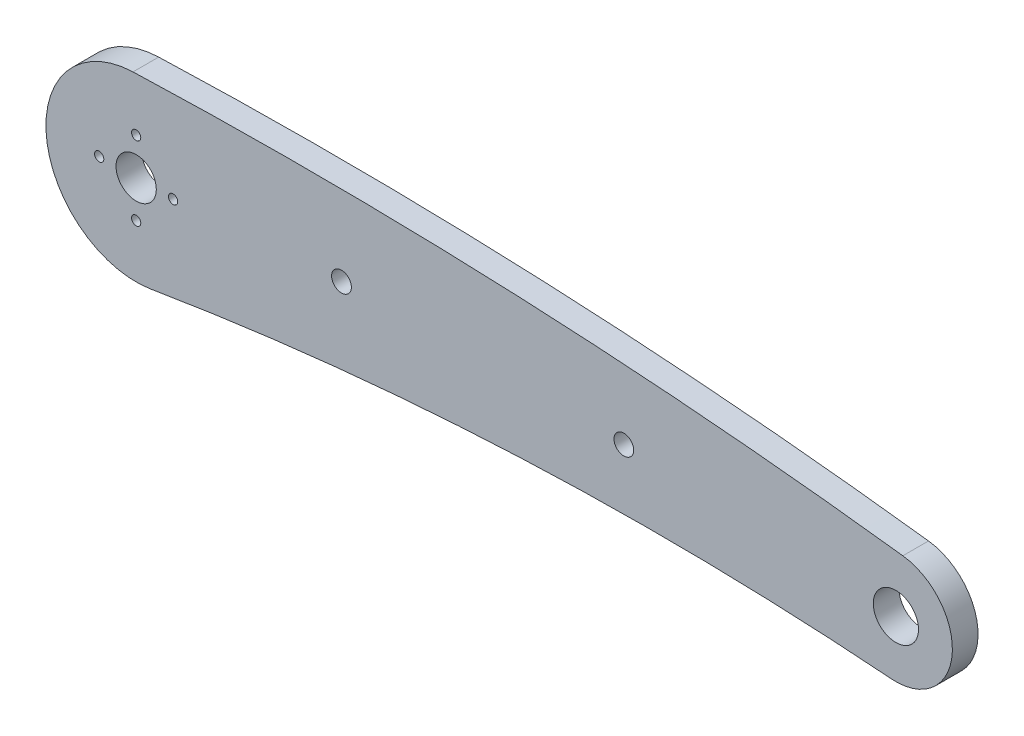
ISO-10303-21;
HEADER;
FILE_DESCRIPTION(('STEP AP214'),'2;1');
FILE_NAME('part.step','',(''),(''),'','','');
FILE_SCHEMA(('AUTOMOTIVE_DESIGN { 1 0 10303 214 1 1 1 1 }'));
ENDSEC;
DATA;
#1=APPLICATION_CONTEXT('core data for automotive mechanical design processes');
#2=APPLICATION_PROTOCOL_DEFINITION('international standard','automotive_design',2000,#1);
#3=PRODUCT_CONTEXT('',#1,'mechanical');
#4=PRODUCT('Part','Part','',(#3));
#5=PRODUCT_RELATED_PRODUCT_CATEGORY('part','',(#4));
#6=PRODUCT_DEFINITION_FORMATION('','',#4);
#7=PRODUCT_DEFINITION_CONTEXT('part definition',#1,'design');
#8=PRODUCT_DEFINITION('design','',#6,#7);
#9=PRODUCT_DEFINITION_SHAPE('','',#8);
#10=(LENGTH_UNIT() NAMED_UNIT(*) SI_UNIT(.MILLI.,.METRE.));
#11=(NAMED_UNIT(*) PLANE_ANGLE_UNIT() SI_UNIT($,.RADIAN.));
#12=(NAMED_UNIT(*) SI_UNIT($,.STERADIAN.) SOLID_ANGLE_UNIT());
#13=UNCERTAINTY_MEASURE_WITH_UNIT(LENGTH_MEASURE(1.E-05),#10,'distance_accuracy_value','');
#14=(GEOMETRIC_REPRESENTATION_CONTEXT(3) GLOBAL_UNCERTAINTY_ASSIGNED_CONTEXT((#13)) GLOBAL_UNIT_ASSIGNED_CONTEXT((#10,
#11,#12)) REPRESENTATION_CONTEXT('',''));
#15=CARTESIAN_POINT('',(0.,0.,0.));
#16=DIRECTION('',(0.,0.,1.));
#17=DIRECTION('',(1.,0.,0.));
#18=AXIS2_PLACEMENT_3D('',#15,#16,#17);
#19=CARTESIAN_POINT('',(16.2151699746623,-465.930427659477,0.));
#20=DIRECTION('',(0.,0.,1.));
#21=DIRECTION('',(1.,0.,0.));
#22=AXIS2_PLACEMENT_3D('',#19,#20,#21);
#23=PLANE('',#22);
#24=CARTESIAN_POINT('',(148.,0.,0.));
#25=DIRECTION('',(0.,0.,-1.));
#26=DIRECTION('',(-1.,0.,0.));
#27=AXIS2_PLACEMENT_3D('',#24,#25,#26);
#28=CIRCLE('',#27,10.9999999999999);
#29=CARTESIAN_POINT('',(147.159069573998,-10.9678090801501,0.));
#30=VERTEX_POINT('',#29);
#31=CARTESIAN_POINT('',(149.353851182702,10.9163678471869,0.));
#32=VERTEX_POINT('',#31);
#33=EDGE_CURVE('E61',#30,#32,#28,.F.);
#34=ORIENTED_EDGE('',*,*,#33,.F.);
#35=CARTESIAN_POINT('',(101.290137246622,-609.211940724704,0.));
#36=DIRECTION('',(0.,0.,-1.));
#37=DIRECTION('',(-1.,0.,0.));
#38=AXIS2_PLACEMENT_3D('',#35,#36,#37);
#39=CIRCLE('',#38,600.);
#40=CARTESIAN_POINT('',(2.88252303300712,-17.3370033732529,0.));
#41=VERTEX_POINT('',#40);
#42=EDGE_CURVE('E76',#30,#41,#39,.F.);
#43=ORIENTED_EDGE('',*,*,#42,.T.);
#44=CARTESIAN_POINT('',(0.,0.,0.));
#45=DIRECTION('',(0.,0.,-1.));
#46=DIRECTION('',(-1.,0.,0.));
#47=AXIS2_PLACEMENT_3D('',#44,#45,#46);
#48=CIRCLE('',#47,17.5749999999999);
#49=CARTESIAN_POINT('',(-0.611269779992363,17.5643666056043,0.));
#50=VERTEX_POINT('',#49);
#51=EDGE_CURVE('E62',#50,#41,#48,.F.);
#52=ORIENTED_EDGE('',*,*,#51,.F.);
#53=CARTESIAN_POINT('',(32.4303399493245,-931.860855318953,0.));
#54=DIRECTION('',(0.,0.,-1.));
#55=DIRECTION('',(-1.,0.,0.));
#56=AXIS2_PLACEMENT_3D('',#53,#54,#55);
#57=CIRCLE('',#56,950.);
#58=EDGE_CURVE('E56',#32,#50,#57,.F.);
#59=ORIENTED_EDGE('',*,*,#58,.F.);
#60=EDGE_LOOP('',(#34,#43,#52,#59));
#61=FACE_BOUND('',#60,.T.);
#62=CARTESIAN_POINT('',(0.,0.,0.));
#63=DIRECTION('',(0.,0.,1.));
#64=DIRECTION('',(1.,0.,0.));
#65=AXIS2_PLACEMENT_3D('',#62,#63,#64);
#66=CIRCLE('',#65,3.925);
#67=CARTESIAN_POINT('',(3.925,0.,0.));
#68=VERTEX_POINT('',#67);
#69=EDGE_CURVE('E66',#68,#68,#66,.T.);
#70=ORIENTED_EDGE('',*,*,#69,.T.);
#71=EDGE_LOOP('',(#70));
#72=FACE_BOUND('',#71,.T.);
#73=CARTESIAN_POINT('',(148.,0.,0.));
#74=DIRECTION('',(0.,0.,1.));
#75=DIRECTION('',(1.,0.,0.));
#76=AXIS2_PLACEMENT_3D('',#73,#74,#75);
#77=CIRCLE('',#76,4.39999999999999);
#78=CARTESIAN_POINT('',(152.4,0.,0.));
#79=VERTEX_POINT('',#78);
#80=EDGE_CURVE('E87',#79,#79,#77,.T.);
#81=ORIENTED_EDGE('',*,*,#80,.T.);
#82=EDGE_LOOP('',(#81));
#83=FACE_BOUND('',#82,.T.);
#84=CARTESIAN_POINT('',(0.,7.2,0.));
#85=DIRECTION('',(0.,0.,1.));
#86=DIRECTION('',(1.,0.,0.));
#87=AXIS2_PLACEMENT_3D('',#84,#85,#86);
#88=CIRCLE('',#87,0.9);
#89=CARTESIAN_POINT('',(0.9,7.2,0.));
#90=VERTEX_POINT('',#89);
#91=EDGE_CURVE('E90',#90,#90,#88,.T.);
#92=ORIENTED_EDGE('',*,*,#91,.T.);
#93=EDGE_LOOP('',(#92));
#94=FACE_BOUND('',#93,.T.);
#95=CARTESIAN_POINT('',(0.,-7.2,0.));
#96=DIRECTION('',(0.,0.,1.));
#97=DIRECTION('',(1.,0.,0.));
#98=AXIS2_PLACEMENT_3D('',#95,#96,#97);
#99=CIRCLE('',#98,0.9);
#100=CARTESIAN_POINT('',(0.9,-7.2,0.));
#101=VERTEX_POINT('',#100);
#102=EDGE_CURVE('E93',#101,#101,#99,.T.);
#103=ORIENTED_EDGE('',*,*,#102,.T.);
#104=EDGE_LOOP('',(#103));
#105=FACE_BOUND('',#104,.T.);
#106=CARTESIAN_POINT('',(7.2,0.,0.));
#107=DIRECTION('',(0.,0.,1.));
#108=DIRECTION('',(1.,0.,0.));
#109=AXIS2_PLACEMENT_3D('',#106,#107,#108);
#110=CIRCLE('',#109,0.9);
#111=CARTESIAN_POINT('',(8.1,0.,0.));
#112=VERTEX_POINT('',#111);
#113=EDGE_CURVE('E96',#112,#112,#110,.T.);
#114=ORIENTED_EDGE('',*,*,#113,.T.);
#115=EDGE_LOOP('',(#114));
#116=FACE_BOUND('',#115,.T.);
#117=CARTESIAN_POINT('',(-7.2,0.,0.));
#118=DIRECTION('',(0.,0.,1.));
#119=DIRECTION('',(1.,0.,0.));
#120=AXIS2_PLACEMENT_3D('',#117,#118,#119);
#121=CIRCLE('',#120,0.9);
#122=CARTESIAN_POINT('',(-6.3,0.,0.));
#123=VERTEX_POINT('',#122);
#124=EDGE_CURVE('E99',#123,#123,#121,.T.);
#125=ORIENTED_EDGE('',*,*,#124,.T.);
#126=EDGE_LOOP('',(#125));
#127=FACE_BOUND('',#126,.T.);
#128=CARTESIAN_POINT('',(40.,2.5,0.));
#129=DIRECTION('',(0.,0.,1.));
#130=DIRECTION('',(1.,0.,0.));
#131=AXIS2_PLACEMENT_3D('',#128,#129,#130);
#132=CIRCLE('',#131,1.925);
#133=CARTESIAN_POINT('',(41.925,2.5,0.));
#134=VERTEX_POINT('',#133);
#135=EDGE_CURVE('E101',#134,#134,#132,.T.);
#136=ORIENTED_EDGE('',*,*,#135,.T.);
#137=EDGE_LOOP('',(#136));
#138=FACE_BOUND('',#137,.T.);
#139=CARTESIAN_POINT('',(95.,2.5,0.));
#140=DIRECTION('',(0.,0.,1.));
#141=DIRECTION('',(1.,0.,0.));
#142=AXIS2_PLACEMENT_3D('',#139,#140,#141);
#143=CIRCLE('',#142,1.925);
#144=CARTESIAN_POINT('',(96.925,2.5,0.));
#145=VERTEX_POINT('',#144);
#146=EDGE_CURVE('E20',#145,#145,#143,.T.);
#147=ORIENTED_EDGE('',*,*,#146,.T.);
#148=EDGE_LOOP('',(#147));
#149=FACE_BOUND('',#148,.T.);
#150=ADVANCED_FACE('F17',(#61,#72,#83,#94,#105,#116,#127,#138,#149),#23,.F.);
#151=CARTESIAN_POINT('',(95.,2.5,-2.));
#152=DIRECTION('',(0.,0.,1.));
#153=DIRECTION('',(1.,0.,0.));
#154=AXIS2_PLACEMENT_3D('',#151,#152,#153);
#155=CYLINDRICAL_SURFACE('',#154,1.925);
#156=CARTESIAN_POINT('',(95.,2.5,5.));
#157=DIRECTION('',(0.,0.,1.));
#158=DIRECTION('',(1.,0.,0.));
#159=AXIS2_PLACEMENT_3D('',#156,#157,#158);
#160=CIRCLE('',#159,1.925);
#161=CARTESIAN_POINT('',(96.925,2.5,5.));
#162=VERTEX_POINT('',#161);
#163=EDGE_CURVE('E81',#162,#162,#160,.F.);
#164=ORIENTED_EDGE('',*,*,#163,.F.);
#165=EDGE_LOOP('',(#164));
#166=FACE_BOUND('',#165,.T.);
#167=ORIENTED_EDGE('',*,*,#146,.F.);
#168=EDGE_LOOP('',(#167));
#169=FACE_BOUND('',#168,.T.);
#170=ADVANCED_FACE('F109',(#166,#169),#155,.F.);
#171=CARTESIAN_POINT('',(40.,2.5,-2.));
#172=DIRECTION('',(0.,0.,1.));
#173=DIRECTION('',(1.,0.,0.));
#174=AXIS2_PLACEMENT_3D('',#171,#172,#173);
#175=CYLINDRICAL_SURFACE('',#174,1.925);
#176=CARTESIAN_POINT('',(40.,2.5,5.));
#177=DIRECTION('',(0.,0.,1.));
#178=DIRECTION('',(1.,0.,0.));
#179=AXIS2_PLACEMENT_3D('',#176,#177,#178);
#180=CIRCLE('',#179,1.925);
#181=CARTESIAN_POINT('',(41.925,2.5,5.));
#182=VERTEX_POINT('',#181);
#183=EDGE_CURVE('E174',#182,#182,#180,.F.);
#184=ORIENTED_EDGE('',*,*,#183,.F.);
#185=EDGE_LOOP('',(#184));
#186=FACE_BOUND('',#185,.T.);
#187=ORIENTED_EDGE('',*,*,#135,.F.);
#188=EDGE_LOOP('',(#187));
#189=FACE_BOUND('',#188,.T.);
#190=ADVANCED_FACE('F111',(#186,#189),#175,.F.);
#191=CARTESIAN_POINT('',(-7.2,0.,-2.));
#192=DIRECTION('',(0.,0.,1.));
#193=DIRECTION('',(1.,0.,0.));
#194=AXIS2_PLACEMENT_3D('',#191,#192,#193);
#195=CYLINDRICAL_SURFACE('',#194,0.9);
#196=CARTESIAN_POINT('',(-7.2,0.,5.));
#197=DIRECTION('',(0.,0.,1.));
#198=DIRECTION('',(1.,0.,0.));
#199=AXIS2_PLACEMENT_3D('',#196,#197,#198);
#200=CIRCLE('',#199,0.9);
#201=CARTESIAN_POINT('',(-6.3,0.,5.));
#202=VERTEX_POINT('',#201);
#203=EDGE_CURVE('E169',#202,#202,#200,.F.);
#204=ORIENTED_EDGE('',*,*,#203,.F.);
#205=EDGE_LOOP('',(#204));
#206=FACE_BOUND('',#205,.T.);
#207=ORIENTED_EDGE('',*,*,#124,.F.);
#208=EDGE_LOOP('',(#207));
#209=FACE_BOUND('',#208,.T.);
#210=ADVANCED_FACE('F118',(#206,#209),#195,.F.);
#211=CARTESIAN_POINT('',(7.2,0.,-2.));
#212=DIRECTION('',(0.,0.,1.));
#213=DIRECTION('',(1.,0.,0.));
#214=AXIS2_PLACEMENT_3D('',#211,#212,#213);
#215=CYLINDRICAL_SURFACE('',#214,0.9);
#216=CARTESIAN_POINT('',(7.2,0.,5.));
#217=DIRECTION('',(0.,0.,1.));
#218=DIRECTION('',(1.,0.,0.));
#219=AXIS2_PLACEMENT_3D('',#216,#217,#218);
#220=CIRCLE('',#219,0.9);
#221=CARTESIAN_POINT('',(8.1,0.,5.));
#222=VERTEX_POINT('',#221);
#223=EDGE_CURVE('E173',#222,#222,#220,.F.);
#224=ORIENTED_EDGE('',*,*,#223,.F.);
#225=EDGE_LOOP('',(#224));
#226=FACE_BOUND('',#225,.T.);
#227=ORIENTED_EDGE('',*,*,#113,.F.);
#228=EDGE_LOOP('',(#227));
#229=FACE_BOUND('',#228,.T.);
#230=ADVANCED_FACE('F157',(#226,#229),#215,.F.);
#231=CARTESIAN_POINT('',(0.,-7.2,-2.));
#232=DIRECTION('',(0.,0.,1.));
#233=DIRECTION('',(1.,0.,0.));
#234=AXIS2_PLACEMENT_3D('',#231,#232,#233);
#235=CYLINDRICAL_SURFACE('',#234,0.9);
#236=CARTESIAN_POINT('',(0.,-7.2,5.));
#237=DIRECTION('',(0.,0.,1.));
#238=DIRECTION('',(1.,0.,0.));
#239=AXIS2_PLACEMENT_3D('',#236,#237,#238);
#240=CIRCLE('',#239,0.9);
#241=CARTESIAN_POINT('',(0.9,-7.2,5.));
#242=VERTEX_POINT('',#241);
#243=EDGE_CURVE('E177',#242,#242,#240,.F.);
#244=ORIENTED_EDGE('',*,*,#243,.F.);
#245=EDGE_LOOP('',(#244));
#246=FACE_BOUND('',#245,.T.);
#247=ORIENTED_EDGE('',*,*,#102,.F.);
#248=EDGE_LOOP('',(#247));
#249=FACE_BOUND('',#248,.T.);
#250=ADVANCED_FACE('F153',(#246,#249),#235,.F.);
#251=CARTESIAN_POINT('',(0.,7.2,-2.));
#252=DIRECTION('',(0.,0.,1.));
#253=DIRECTION('',(1.,0.,0.));
#254=AXIS2_PLACEMENT_3D('',#251,#252,#253);
#255=CYLINDRICAL_SURFACE('',#254,0.9);
#256=CARTESIAN_POINT('',(0.,7.2,5.));
#257=DIRECTION('',(0.,0.,1.));
#258=DIRECTION('',(1.,0.,0.));
#259=AXIS2_PLACEMENT_3D('',#256,#257,#258);
#260=CIRCLE('',#259,0.9);
#261=CARTESIAN_POINT('',(0.9,7.2,5.));
#262=VERTEX_POINT('',#261);
#263=EDGE_CURVE('E183',#262,#262,#260,.F.);
#264=ORIENTED_EDGE('',*,*,#263,.F.);
#265=EDGE_LOOP('',(#264));
#266=FACE_BOUND('',#265,.T.);
#267=ORIENTED_EDGE('',*,*,#91,.F.);
#268=EDGE_LOOP('',(#267));
#269=FACE_BOUND('',#268,.T.);
#270=ADVANCED_FACE('F149',(#266,#269),#255,.F.);
#271=CARTESIAN_POINT('',(148.,0.,-2.));
#272=DIRECTION('',(0.,0.,1.));
#273=DIRECTION('',(1.,0.,0.));
#274=AXIS2_PLACEMENT_3D('',#271,#272,#273);
#275=CYLINDRICAL_SURFACE('',#274,4.39999999999999);
#276=CARTESIAN_POINT('',(148.,0.,5.));
#277=DIRECTION('',(0.,0.,1.));
#278=DIRECTION('',(1.,0.,0.));
#279=AXIS2_PLACEMENT_3D('',#276,#277,#278);
#280=CIRCLE('',#279,4.39999999999999);
#281=CARTESIAN_POINT('',(152.4,0.,5.));
#282=VERTEX_POINT('',#281);
#283=EDGE_CURVE('E186',#282,#282,#280,.F.);
#284=ORIENTED_EDGE('',*,*,#283,.F.);
#285=EDGE_LOOP('',(#284));
#286=FACE_BOUND('',#285,.T.);
#287=ORIENTED_EDGE('',*,*,#80,.F.);
#288=EDGE_LOOP('',(#287));
#289=FACE_BOUND('',#288,.T.);
#290=ADVANCED_FACE('F145',(#286,#289),#275,.F.);
#291=CARTESIAN_POINT('',(0.,0.,-2.));
#292=DIRECTION('',(0.,0.,1.));
#293=DIRECTION('',(1.,0.,0.));
#294=AXIS2_PLACEMENT_3D('',#291,#292,#293);
#295=CYLINDRICAL_SURFACE('',#294,3.925);
#296=CARTESIAN_POINT('',(0.,0.,5.));
#297=DIRECTION('',(0.,0.,1.));
#298=DIRECTION('',(1.,0.,0.));
#299=AXIS2_PLACEMENT_3D('',#296,#297,#298);
#300=CIRCLE('',#299,3.925);
#301=CARTESIAN_POINT('',(3.925,0.,5.));
#302=VERTEX_POINT('',#301);
#303=EDGE_CURVE('E189',#302,#302,#300,.F.);
#304=ORIENTED_EDGE('',*,*,#303,.F.);
#305=EDGE_LOOP('',(#304));
#306=FACE_BOUND('',#305,.T.);
#307=ORIENTED_EDGE('',*,*,#69,.F.);
#308=EDGE_LOOP('',(#307));
#309=FACE_BOUND('',#308,.T.);
#310=ADVANCED_FACE('F142',(#306,#309),#295,.F.);
#311=CARTESIAN_POINT('',(32.4303399493245,-931.860855318953,5.));
#312=DIRECTION('',(0.,0.,-1.));
#313=DIRECTION('',(-1.,0.,0.));
#314=AXIS2_PLACEMENT_3D('',#311,#312,#313);
#315=CYLINDRICAL_SURFACE('',#314,950.);
#316=CARTESIAN_POINT('',(32.4303399493245,-931.860855318953,5.));
#317=DIRECTION('',(0.,0.,-1.));
#318=DIRECTION('',(-1.,0.,0.));
#319=AXIS2_PLACEMENT_3D('',#316,#317,#318);
#320=CIRCLE('',#319,950.);
#321=CARTESIAN_POINT('',(149.353851182702,10.9163678471869,5.));
#322=VERTEX_POINT('',#321);
#323=CARTESIAN_POINT('',(-0.61126977999236,17.5643666056042,5.));
#324=VERTEX_POINT('',#323);
#325=EDGE_CURVE('E72',#322,#324,#320,.F.);
#326=ORIENTED_EDGE('',*,*,#325,.F.);
#327=DIRECTION('',(0.,0.,-1.));
#328=VECTOR('',#327,1.);
#329=CARTESIAN_POINT('',(149.353851182702,10.9163678471868,5.));
#330=LINE('',#329,#328);
#331=EDGE_CURVE('E69',#32,#322,#330,.F.);
#332=ORIENTED_EDGE('',*,*,#331,.F.);
#333=ORIENTED_EDGE('',*,*,#58,.T.);
#334=DIRECTION('',(0.,0.,-1.));
#335=VECTOR('',#334,1.);
#336=CARTESIAN_POINT('',(-0.61126977999236,17.5643666056043,5.));
#337=LINE('',#336,#335);
#338=EDGE_CURVE('E65',#324,#50,#337,.T.);
#339=ORIENTED_EDGE('',*,*,#338,.F.);
#340=EDGE_LOOP('',(#326,#332,#333,#339));
#341=FACE_BOUND('',#340,.T.);
#342=ADVANCED_FACE('F70',(#341),#315,.T.);
#343=CARTESIAN_POINT('',(0.,0.,5.));
#344=DIRECTION('',(0.,0.,-1.));
#345=DIRECTION('',(-1.,0.,0.));
#346=AXIS2_PLACEMENT_3D('',#343,#344,#345);
#347=CYLINDRICAL_SURFACE('',#346,17.5749999999999);
#348=ORIENTED_EDGE('',*,*,#51,.T.);
#349=DIRECTION('',(0.,0.,-1.));
#350=VECTOR('',#349,1.);
#351=CARTESIAN_POINT('',(2.88252303300712,-17.3370033732529,5.));
#352=LINE('',#351,#350);
#353=CARTESIAN_POINT('',(2.88252303300712,-17.3370033732529,5.));
#354=VERTEX_POINT('',#353);
#355=EDGE_CURVE('E78',#41,#354,#352,.F.);
#356=ORIENTED_EDGE('',*,*,#355,.T.);
#357=CARTESIAN_POINT('',(0.,0.,5.));
#358=DIRECTION('',(0.,0.,-1.));
#359=DIRECTION('',(-1.,0.,0.));
#360=AXIS2_PLACEMENT_3D('',#357,#358,#359);
#361=CIRCLE('',#360,17.5749999999999);
#362=EDGE_CURVE('E193',#324,#354,#361,.F.);
#363=ORIENTED_EDGE('',*,*,#362,.F.);
#364=ORIENTED_EDGE('',*,*,#338,.T.);
#365=EDGE_LOOP('',(#348,#356,#363,#364));
#366=FACE_BOUND('',#365,.T.);
#367=ADVANCED_FACE('F136',(#366),#347,.T.);
#368=CARTESIAN_POINT('',(101.290137246622,-609.211940724704,5.));
#369=DIRECTION('',(0.,0.,-1.));
#370=DIRECTION('',(-1.,0.,0.));
#371=AXIS2_PLACEMENT_3D('',#368,#369,#370);
#372=CYLINDRICAL_SURFACE('',#371,600.);
#373=DIRECTION('',(0.,0.,-1.));
#374=VECTOR('',#373,1.);
#375=CARTESIAN_POINT('',(147.159069573998,-10.9678090801501,5.));
#376=LINE('',#375,#374);
#377=CARTESIAN_POINT('',(147.159069573998,-10.9678090801501,5.));
#378=VERTEX_POINT('',#377);
#379=EDGE_CURVE('E35',#378,#30,#376,.T.);
#380=ORIENTED_EDGE('',*,*,#379,.F.);
#381=CARTESIAN_POINT('',(101.290137246622,-609.211940724704,5.));
#382=DIRECTION('',(0.,0.,-1.));
#383=DIRECTION('',(-1.,0.,0.));
#384=AXIS2_PLACEMENT_3D('',#381,#382,#383);
#385=CIRCLE('',#384,600.);
#386=EDGE_CURVE('E26',#354,#378,#385,.T.);
#387=ORIENTED_EDGE('',*,*,#386,.F.);
#388=ORIENTED_EDGE('',*,*,#355,.F.);
#389=ORIENTED_EDGE('',*,*,#42,.F.);
#390=EDGE_LOOP('',(#380,#387,#388,#389));
#391=FACE_BOUND('',#390,.T.);
#392=ADVANCED_FACE('F129',(#391),#372,.F.);
#393=CARTESIAN_POINT('',(148.,0.,5.));
#394=DIRECTION('',(0.,0.,-1.));
#395=DIRECTION('',(-1.,0.,0.));
#396=AXIS2_PLACEMENT_3D('',#393,#394,#395);
#397=CYLINDRICAL_SURFACE('',#396,10.9999999999999);
#398=CARTESIAN_POINT('',(148.,0.,5.));
#399=DIRECTION('',(0.,0.,-1.));
#400=DIRECTION('',(-1.,0.,0.));
#401=AXIS2_PLACEMENT_3D('',#398,#399,#400);
#402=CIRCLE('',#401,10.9999999999999);
#403=EDGE_CURVE('E11',#378,#322,#402,.F.);
#404=ORIENTED_EDGE('',*,*,#403,.F.);
#405=ORIENTED_EDGE('',*,*,#379,.T.);
#406=ORIENTED_EDGE('',*,*,#33,.T.);
#407=ORIENTED_EDGE('',*,*,#331,.T.);
#408=EDGE_LOOP('',(#404,#405,#406,#407));
#409=FACE_BOUND('',#408,.T.);
#410=ADVANCED_FACE('F75',(#409),#397,.T.);
#411=CARTESIAN_POINT('',(16.2151699746623,-465.930427659477,5.));
#412=DIRECTION('',(0.,0.,1.));
#413=DIRECTION('',(1.,0.,0.));
#414=AXIS2_PLACEMENT_3D('',#411,#412,#413);
#415=PLANE('',#414);
#416=ORIENTED_EDGE('',*,*,#386,.T.);
#417=ORIENTED_EDGE('',*,*,#403,.T.);
#418=ORIENTED_EDGE('',*,*,#325,.T.);
#419=ORIENTED_EDGE('',*,*,#362,.T.);
#420=EDGE_LOOP('',(#416,#417,#418,#419));
#421=FACE_BOUND('',#420,.T.);
#422=ORIENTED_EDGE('',*,*,#303,.T.);
#423=EDGE_LOOP('',(#422));
#424=FACE_BOUND('',#423,.T.);
#425=ORIENTED_EDGE('',*,*,#283,.T.);
#426=EDGE_LOOP('',(#425));
#427=FACE_BOUND('',#426,.T.);
#428=ORIENTED_EDGE('',*,*,#263,.T.);
#429=EDGE_LOOP('',(#428));
#430=FACE_BOUND('',#429,.T.);
#431=ORIENTED_EDGE('',*,*,#243,.T.);
#432=EDGE_LOOP('',(#431));
#433=FACE_BOUND('',#432,.T.);
#434=ORIENTED_EDGE('',*,*,#223,.T.);
#435=EDGE_LOOP('',(#434));
#436=FACE_BOUND('',#435,.T.);
#437=ORIENTED_EDGE('',*,*,#203,.T.);
#438=EDGE_LOOP('',(#437));
#439=FACE_BOUND('',#438,.T.);
#440=ORIENTED_EDGE('',*,*,#183,.T.);
#441=EDGE_LOOP('',(#440));
#442=FACE_BOUND('',#441,.T.);
#443=ORIENTED_EDGE('',*,*,#163,.T.);
#444=EDGE_LOOP('',(#443));
#445=FACE_BOUND('',#444,.T.);
#446=ADVANCED_FACE('F122',(#421,#424,#427,#430,#433,#436,#439,#442,#445),#415,.T.);
#447=CLOSED_SHELL('',(#150,#170,#190,#210,#230,#250,#270,#290,#310,#342,#367,#392,#410,#446));
#448=MANIFOLD_SOLID_BREP('B1',#447);
#449=ADVANCED_BREP_SHAPE_REPRESENTATION('',(#18,#448),#14);
#450=SHAPE_DEFINITION_REPRESENTATION(#9,#449);
ENDSEC;
END-ISO-10303-21;
